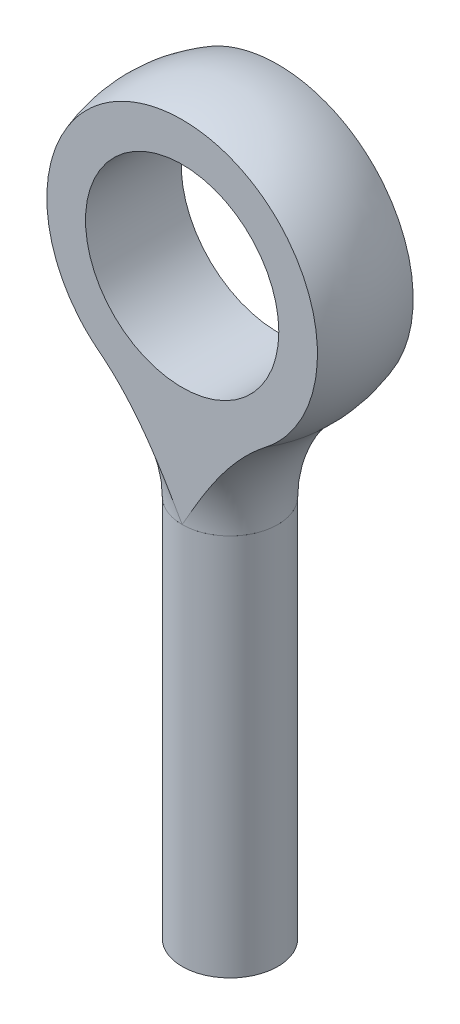
ISO-10303-21;
HEADER;
FILE_DESCRIPTION(('STEP AP214'),'2;1');
FILE_NAME('part.step','',(''),(''),'','','');
FILE_SCHEMA(('AUTOMOTIVE_DESIGN { 1 0 10303 214 1 1 1 1 }'));
ENDSEC;
DATA;
#1=APPLICATION_CONTEXT('core data for automotive mechanical design processes');
#2=APPLICATION_PROTOCOL_DEFINITION('international standard','automotive_design',2000,#1);
#3=PRODUCT_CONTEXT('',#1,'mechanical');
#4=PRODUCT('Part','Part','',(#3));
#5=PRODUCT_RELATED_PRODUCT_CATEGORY('part','',(#4));
#6=PRODUCT_DEFINITION_FORMATION('','',#4);
#7=PRODUCT_DEFINITION_CONTEXT('part definition',#1,'design');
#8=PRODUCT_DEFINITION('design','',#6,#7);
#9=PRODUCT_DEFINITION_SHAPE('','',#8);
#10=(LENGTH_UNIT() NAMED_UNIT(*) SI_UNIT(.MILLI.,.METRE.));
#11=(NAMED_UNIT(*) PLANE_ANGLE_UNIT() SI_UNIT($,.RADIAN.));
#12=(NAMED_UNIT(*) SI_UNIT($,.STERADIAN.) SOLID_ANGLE_UNIT());
#13=UNCERTAINTY_MEASURE_WITH_UNIT(LENGTH_MEASURE(1.E-05),#10,'distance_accuracy_value','');
#14=(GEOMETRIC_REPRESENTATION_CONTEXT(3) GLOBAL_UNCERTAINTY_ASSIGNED_CONTEXT((#13)) GLOBAL_UNIT_ASSIGNED_CONTEXT((#10,
#11,#12)) REPRESENTATION_CONTEXT('',''));
#15=CARTESIAN_POINT('',(0.,0.,0.));
#16=DIRECTION('',(0.,0.,1.));
#17=DIRECTION('',(1.,0.,0.));
#18=AXIS2_PLACEMENT_3D('',#15,#16,#17);
#19=CARTESIAN_POINT('',(0.,0.,0.));
#20=DIRECTION('',(0.,1.,0.));
#21=DIRECTION('',(-1.,0.,0.));
#22=AXIS2_PLACEMENT_3D('',#19,#20,#21);
#23=TOROIDAL_SURFACE('',#22,12.8984375,9.72343749999999);
#24=CARTESIAN_POINT('',(0.,0.,0.));
#25=DIRECTION('',(0.,1.,0.));
#26=DIRECTION('',(-1.,0.,0.));
#27=AXIS2_PLACEMENT_3D('',#24,#25,#26);
#28=CIRCLE('',#27,3.17499999999999);
#29=CARTESIAN_POINT('',(0.,0.,3.17499999999999));
#30=VERTEX_POINT('',#29);
#31=CARTESIAN_POINT('',(0.,0.,-3.17499999999999));
#32=VERTEX_POINT('',#31);
#33=EDGE_CURVE('E95',#30,#32,#28,.T.);
#34=ORIENTED_EDGE('',*,*,#33,.T.);
#35=CARTESIAN_POINT('',(0.,0.,-3.17500000000001));
#36=CARTESIAN_POINT('',(0.00326153280925607,0.0057076845832613,-3.17500000000001));
#37=CARTESIAN_POINT('',(0.00652306727233209,0.0114153698480768,-3.17500000000002));
#38=CARTESIAN_POINT('',(0.273129494103205,0.477974240386817,-3.1750000000004));
#39=CARTESIAN_POINT('',(0.536560192564701,0.938786382511424,-3.17500000000012));
#40=CARTESIAN_POINT('',(1.07566265444869,1.85322785392022,-3.17499999999992));
#41=CARTESIAN_POINT('',(1.35133223121141,2.3068584468054,-3.17499999999999));
#42=CARTESIAN_POINT('',(1.92559609432879,3.19894900715336,-3.17500000000004));
#43=CARTESIAN_POINT('',(2.22416629490134,3.63742422867332,-3.17500000000002));
#44=CARTESIAN_POINT('',(2.85309895626272,4.49102276263993,-3.17500000000001));
#45=CARTESIAN_POINT('',(3.18344395159612,4.9061587072404,-3.17500000000001));
#46=CARTESIAN_POINT('',(3.77466960905666,5.58162755339801,-3.17500000000001));
#47=CARTESIAN_POINT('',(4.0258500915174,5.85044049904177,-3.17500000000001));
#48=CARTESIAN_POINT('',(4.54711374407405,6.3690146541668,-3.17500000000001));
#49=CARTESIAN_POINT('',(4.81719088353272,6.61878188915435,-3.17500000000001));
#50=CARTESIAN_POINT('',(5.37662445731924,7.09612768080226,-3.17500000000001));
#51=CARTESIAN_POINT('',(5.66599147541127,7.32369388493563,-3.17500000000001));
#52=CARTESIAN_POINT('',(6.26322715755371,7.75319037760378,-3.17500000000001));
#53=CARTESIAN_POINT('',(6.57109562034731,7.95512094492604,-3.17500000000001));
#54=CARTESIAN_POINT('',(7.20718830531294,8.33213779574423,-3.17500000000001));
#55=CARTESIAN_POINT('',(7.53558873717857,8.50692791162476,-3.17500000000001));
#56=CARTESIAN_POINT('',(8.20771747668496,8.82419193058537,-3.17500000000001));
#57=CARTESIAN_POINT('',(8.55144656908544,8.96666417685532,-3.17500000000001));
#58=CARTESIAN_POINT('',(9.25110720222469,9.21656726401151,-3.17500000000001));
#59=CARTESIAN_POINT('',(9.60702765350869,9.32402906217074,-3.17500000000001));
#60=CARTESIAN_POINT('',(10.3280020281628,9.50191139488332,-3.17500000000001));
#61=CARTESIAN_POINT('',(10.6930544047708,9.57233815850714,-3.17500000000001));
#62=CARTESIAN_POINT('',(11.374148117763,9.66696888095685,-3.17500000000001));
#63=CARTESIAN_POINT('',(11.6894621095443,9.69646466998725,-3.17500000000001));
#64=CARTESIAN_POINT('',(12.3214131945616,9.72667494727204,-3.17500000000001));
#65=CARTESIAN_POINT('',(12.6380499892568,9.72739561225399,-3.17500000000001));
#66=CARTESIAN_POINT('',(13.2714560117321,9.69958458823531,-3.17500000000001));
#67=CARTESIAN_POINT('',(13.5882199938706,9.67092754785116,-3.17500000000001));
#68=CARTESIAN_POINT('',(14.0603016308951,9.60580647493132,-3.17500000000001));
#69=CARTESIAN_POINT('',(14.2172131664777,9.58039570302873,-3.17500000000001));
#70=CARTESIAN_POINT('',(14.5296709917818,9.52221005311375,-3.17500000000001));
#71=CARTESIAN_POINT('',(14.6852172274489,9.48943488488835,-3.17500000000001));
#72=CARTESIAN_POINT('',(14.8399244089043,9.45298870973377,-3.17500000000001));
#73=B_SPLINE_CURVE_WITH_KNOTS('',3,(#35,#36,#37,#38,#39,#40,#41,#42,#43,#44,#45,#46,#47,#48,#49,
#50,#51,#52,#53,#54,#55,#56,#57,#58,#59,#60,#61,#62,#63,#64,#65,#66,#67,#68,#69,#70,#71,#72),
.UNSPECIFIED.,.F.,.F.,(4,2,2,2,2,2,2,2,2,2,2,2,2,2,2,2,2,2,4),(0.,0.0197214984217776,
1.61208077496624,3.20415668854148,4.79458050737365,6.38413506978644,7.48699761771061,
8.58950979193574,9.69263194037353,10.7957420913339,11.91015194267,13.0246189125133,
14.1380977461375,15.2513892393585,16.2001992986528,17.1488056899198,18.1014765941837,
18.5781908797589,19.0549239547851),.UNSPECIFIED.);
#74=CARTESIAN_POINT('',(5.53702467554139,7.21739690722649,-3.17500000000001));
#75=VERTEX_POINT('',#74);
#76=EDGE_CURVE('E12',#32,#75,#73,.T.);
#77=ORIENTED_EDGE('',*,*,#76,.T.);
#78=CARTESIAN_POINT('',(0.,7.2173969072165,0.));
#79=DIRECTION('',(0.,1.,0.));
#80=DIRECTION('',(-1.,0.,0.));
#81=AXIS2_PLACEMENT_3D('',#78,#79,#80);
#82=CIRCLE('',#81,6.38273195876288);
#83=CARTESIAN_POINT('',(5.5370246755414,7.21739690722649,3.17500000000001));
#84=VERTEX_POINT('',#83);
#85=EDGE_CURVE('E101',#84,#75,#82,.T.);
#86=ORIENTED_EDGE('',*,*,#85,.F.);
#87=CARTESIAN_POINT('',(0.,0.,3.175));
#88=CARTESIAN_POINT('',(0.00326153280983366,0.00570768458293391,3.17500000000001));
#89=CARTESIAN_POINT('',(0.00652306727347502,0.0114153698474264,3.17500000000001));
#90=CARTESIAN_POINT('',(0.273129494151941,0.477974240364465,3.1750000000003));
#91=CARTESIAN_POINT('',(0.536560192581877,0.938786382512609,3.17500000000009));
#92=CARTESIAN_POINT('',(1.07566265444589,1.85322785394333,3.17499999999994));
#93=CARTESIAN_POINT('',(1.35133223122016,2.30685844682691,3.17499999999999));
#94=CARTESIAN_POINT('',(1.92559609434861,3.19894900717623,3.17500000000003));
#95=CARTESIAN_POINT('',(2.2241662949206,3.6374242286992,3.17500000000002));
#96=CARTESIAN_POINT('',(2.85309895628501,4.49102276267044,3.175));
#97=CARTESIAN_POINT('',(3.18344395162206,4.90615870727247,3.17500000000001));
#98=CARTESIAN_POINT('',(3.77466960908563,5.58162755342941,3.17500000000001));
#99=CARTESIAN_POINT('',(4.02585009154564,5.85044049907114,3.17500000000001));
#100=CARTESIAN_POINT('',(4.54711374410087,6.3690146541922,3.17500000000001));
#101=CARTESIAN_POINT('',(4.81719088355883,6.61878188917779,3.17500000000001));
#102=CARTESIAN_POINT('',(5.37662445734494,7.09612768082301,3.17500000000001));
#103=CARTESIAN_POINT('',(5.66599147543737,7.32369388495554,3.17500000000001));
#104=CARTESIAN_POINT('',(6.26322715758068,7.75319037762204,3.17500000000001));
#105=CARTESIAN_POINT('',(6.57109562037478,7.95512094494346,3.17500000000001));
#106=CARTESIAN_POINT('',(7.20718830534095,8.33213779575968,3.17500000000001));
#107=CARTESIAN_POINT('',(7.53558873720661,8.50692791163909,3.17500000000001));
#108=CARTESIAN_POINT('',(8.20771747671292,8.82419193059747,3.17500000000001));
#109=CARTESIAN_POINT('',(8.55144656911327,8.9666641768663,3.17500000000001));
#110=CARTESIAN_POINT('',(9.25110720225114,9.21656726401992,3.17500000000001));
#111=CARTESIAN_POINT('',(9.60702765353383,9.3240290621778,3.17500000000001));
#112=CARTESIAN_POINT('',(10.3280020281852,9.50191139488799,3.17500000000001));
#113=CARTESIAN_POINT('',(10.6930544047918,9.57233815851074,3.17500000000001));
#114=CARTESIAN_POINT('',(11.3741481177817,9.66696888095886,3.17500000000001));
#115=CARTESIAN_POINT('',(11.6894621095622,9.69646466998862,3.17500000000001));
#116=CARTESIAN_POINT('',(12.3214131945779,9.7266749472723,3.17500000000001));
#117=CARTESIAN_POINT('',(12.6380499892723,9.72739561225377,3.17500000000001));
#118=CARTESIAN_POINT('',(13.271456011747,9.6995845882342,3.17500000000001));
#119=CARTESIAN_POINT('',(13.5882199938857,9.67092754784957,3.17500000000001));
#120=CARTESIAN_POINT('',(14.0603016309106,9.60580647492894,3.17500000000001));
#121=CARTESIAN_POINT('',(14.2172131664933,9.58039570302608,3.17500000000001));
#122=CARTESIAN_POINT('',(14.5296709917976,9.52221005311055,3.17500000000001));
#123=CARTESIAN_POINT('',(14.6852172274648,9.48943488488487,3.17500000000001));
#124=CARTESIAN_POINT('',(14.8399244089203,9.45298870973,3.17500000000001));
#125=B_SPLINE_CURVE_WITH_KNOTS('',3,(#87,#88,#89,#90,#91,#92,#93,#94,#95,#96,#97,#98,#99,#100,
#101,#102,#103,#104,#105,#106,#107,#108,#109,#110,#111,#112,#113,#114,#115,#116,#117,#118,#119,
#120,#121,#122,#123,#124),.UNSPECIFIED.,.F.,.F.,(4,2,2,2,2,2,2,2,2,2,2,2,2,2,2,2,2,2,4),(0.,
0.0197214984217776,1.61208077498055,3.20415668856883,4.79458050740816,6.38413506983101,
7.48699761774936,8.58950979196893,9.69263194040611,10.7957420913663,11.910151942701,
13.0246189125426,14.1380977461619,15.2513892393781,16.2001992986699,17.1488056899344,
18.1014765941992,18.5781908797748,19.0549239548015),.UNSPECIFIED.);
#126=EDGE_CURVE('E87',#84,#30,#125,.F.);
#127=ORIENTED_EDGE('',*,*,#126,.T.);
#128=EDGE_LOOP('',(#34,#77,#86,#127));
#129=FACE_BOUND('',#128,.T.);
#130=ADVANCED_FACE('F51',(#129),#23,.F.);
#131=CARTESIAN_POINT('',(0.,14.2875,0.));
#132=DIRECTION('',(0.,1.,0.));
#133=DIRECTION('',(1.,0.,0.));
#134=AXIS2_PLACEMENT_3D('',#131,#132,#133);
#135=SPHERICAL_SURFACE('',#134,9.525);
#136=ORIENTED_EDGE('',*,*,#85,.T.);
#137=CARTESIAN_POINT('',(0.,14.2875,-3.175));
#138=DIRECTION('',(0.,0.,1.));
#139=DIRECTION('',(0.,-1.,0.));
#140=AXIS2_PLACEMENT_3D('',#137,#138,#139);
#141=CIRCLE('',#140,8.98025612106915);
#142=CARTESIAN_POINT('',(-5.5370246755414,7.21739690722649,-3.17500000000001));
#143=VERTEX_POINT('',#142);
#144=EDGE_CURVE('E104',#75,#143,#141,.T.);
#145=ORIENTED_EDGE('',*,*,#144,.T.);
#146=CARTESIAN_POINT('',(-5.53702467554139,7.21739690722648,3.17500000000001));
#147=VERTEX_POINT('',#146);
#148=EDGE_CURVE('E103',#143,#147,#82,.T.);
#149=ORIENTED_EDGE('',*,*,#148,.T.);
#150=CARTESIAN_POINT('',(0.,14.2875,3.175));
#151=DIRECTION('',(0.,0.,-1.));
#152=DIRECTION('',(0.,1.,0.));
#153=AXIS2_PLACEMENT_3D('',#150,#151,#152);
#154=CIRCLE('',#153,8.98025612106915);
#155=EDGE_CURVE('E90',#147,#84,#154,.T.);
#156=ORIENTED_EDGE('',*,*,#155,.T.);
#157=EDGE_LOOP('',(#136,#145,#149,#156));
#158=FACE_BOUND('',#157,.T.);
#159=ADVANCED_FACE('F53',(#158),#135,.T.);
#160=CARTESIAN_POINT('',(3.17499999999999,0.,0.));
#161=DIRECTION('',(0.,1.,0.));
#162=DIRECTION('',(-1.,0.,0.));
#163=AXIS2_PLACEMENT_3D('',#160,#161,#162);
#164=PLANE('',#163);
#165=ORIENTED_EDGE('',*,*,#33,.F.);
#166=EDGE_CURVE('E107',#32,#30,#28,.T.);
#167=ORIENTED_EDGE('',*,*,#166,.F.);
#168=EDGE_LOOP('',(#165,#167));
#169=FACE_BOUND('',#168,.T.);
#170=ADVANCED_FACE('F125',(#169),#164,.F.);
#171=ORIENTED_EDGE('',*,*,#148,.F.);
#172=CARTESIAN_POINT('',(0.,0.,-3.17500000000001));
#173=CARTESIAN_POINT('',(-0.00326153280925607,0.0057076845832613,-3.17500000000001));
#174=CARTESIAN_POINT('',(-0.00652306727233209,0.0114153698480768,-3.17500000000002));
#175=CARTESIAN_POINT('',(-0.273129494103204,0.477974240386817,-3.1750000000004));
#176=CARTESIAN_POINT('',(-0.536560192564701,0.938786382511425,-3.17500000000012));
#177=CARTESIAN_POINT('',(-1.07566265444869,1.85322785392022,-3.17499999999992));
#178=CARTESIAN_POINT('',(-1.35133223121141,2.3068584468054,-3.17499999999999));
#179=CARTESIAN_POINT('',(-1.92559609432879,3.19894900715336,-3.17500000000004));
#180=CARTESIAN_POINT('',(-2.22416629490134,3.63742422867331,-3.17500000000002));
#181=CARTESIAN_POINT('',(-2.85309895626272,4.49102276263993,-3.17500000000001));
#182=CARTESIAN_POINT('',(-3.18344395159612,4.9061587072404,-3.17500000000001));
#183=CARTESIAN_POINT('',(-3.77466960905666,5.58162755339801,-3.17500000000001));
#184=CARTESIAN_POINT('',(-4.0258500915174,5.85044049904176,-3.17500000000001));
#185=CARTESIAN_POINT('',(-4.54711374407406,6.3690146541668,-3.17500000000001));
#186=CARTESIAN_POINT('',(-4.81719088353272,6.61878188915435,-3.17500000000001));
#187=CARTESIAN_POINT('',(-5.37662445731924,7.09612768080226,-3.17500000000001));
#188=CARTESIAN_POINT('',(-5.66599147541127,7.32369388493562,-3.17500000000001));
#189=CARTESIAN_POINT('',(-6.26322715755371,7.75319037760378,-3.17500000000001));
#190=CARTESIAN_POINT('',(-6.57109562034732,7.95512094492604,-3.17500000000001));
#191=CARTESIAN_POINT('',(-7.20718830531295,8.33213779574423,-3.17500000000001));
#192=CARTESIAN_POINT('',(-7.53558873717857,8.50692791162476,-3.17500000000001));
#193=CARTESIAN_POINT('',(-8.20771747668496,8.82419193058537,-3.17500000000001));
#194=CARTESIAN_POINT('',(-8.55144656908544,8.96666417685532,-3.17500000000001));
#195=CARTESIAN_POINT('',(-9.2511072022247,9.2165672640115,-3.17500000000001));
#196=CARTESIAN_POINT('',(-9.60702765350869,9.32402906217073,-3.17500000000001));
#197=CARTESIAN_POINT('',(-10.3280020281628,9.50191139488332,-3.17500000000001));
#198=CARTESIAN_POINT('',(-10.6930544047708,9.57233815850713,-3.17500000000001));
#199=CARTESIAN_POINT('',(-11.374148117763,9.66696888095685,-3.17500000000001));
#200=CARTESIAN_POINT('',(-11.6894621095443,9.69646466998724,-3.17500000000001));
#201=CARTESIAN_POINT('',(-12.3214131945616,9.72667494727204,-3.17500000000001));
#202=CARTESIAN_POINT('',(-12.6380499892568,9.72739561225399,-3.17500000000001));
#203=CARTESIAN_POINT('',(-13.2714560117321,9.6995845882353,-3.17500000000001));
#204=CARTESIAN_POINT('',(-13.5882199938706,9.67092754785116,-3.17500000000001));
#205=CARTESIAN_POINT('',(-14.0603016308951,9.60580647493132,-3.17500000000001));
#206=CARTESIAN_POINT('',(-14.2172131664777,9.58039570302873,-3.17500000000001));
#207=CARTESIAN_POINT('',(-14.5296709917818,9.52221005311375,-3.17500000000001));
#208=CARTESIAN_POINT('',(-14.6852172274489,9.48943488488835,-3.17500000000001));
#209=CARTESIAN_POINT('',(-14.8399244089043,9.45298870973377,-3.17500000000001));
#210=B_SPLINE_CURVE_WITH_KNOTS('',3,(#172,#173,#174,#175,#176,#177,#178,#179,#180,#181,#182,
#183,#184,#185,#186,#187,#188,#189,#190,#191,#192,#193,#194,#195,#196,#197,#198,#199,#200,#201,
#202,#203,#204,#205,#206,#207,#208,#209),.UNSPECIFIED.,.F.,.F.,(4,2,2,2,2,2,2,2,2,2,2,2,2,2,2,2,
2,2,4),(0.,0.0197214984217776,1.61208077496624,3.20415668854148,4.79458050737365,
6.38413506978644,7.48699761771061,8.58950979193574,9.69263194037353,10.7957420913339,
11.91015194267,13.0246189125133,14.1380977461375,15.2513892393585,16.2001992986528,
17.1488056899198,18.1014765941837,18.5781908797589,19.0549239547851),.UNSPECIFIED.);
#211=EDGE_CURVE('E65',#143,#32,#210,.F.);
#212=ORIENTED_EDGE('',*,*,#211,.T.);
#213=ORIENTED_EDGE('',*,*,#166,.T.);
#214=CARTESIAN_POINT('',(0.,0.,3.175));
#215=CARTESIAN_POINT('',(-0.00326153280983366,0.00570768458293391,3.17500000000001));
#216=CARTESIAN_POINT('',(-0.00652306727347502,0.0114153698474264,3.17500000000001));
#217=CARTESIAN_POINT('',(-0.273129494151941,0.477974240364465,3.1750000000003));
#218=CARTESIAN_POINT('',(-0.536560192581877,0.938786382512609,3.17500000000009));
#219=CARTESIAN_POINT('',(-1.07566265444589,1.85322785394333,3.17499999999994));
#220=CARTESIAN_POINT('',(-1.35133223122016,2.30685844682691,3.17499999999999));
#221=CARTESIAN_POINT('',(-1.92559609434862,3.19894900717623,3.17500000000003));
#222=CARTESIAN_POINT('',(-2.22416629492061,3.6374242286992,3.17500000000002));
#223=CARTESIAN_POINT('',(-2.85309895628501,4.49102276267044,3.175));
#224=CARTESIAN_POINT('',(-3.18344395162206,4.90615870727247,3.17500000000001));
#225=CARTESIAN_POINT('',(-3.77466960908563,5.58162755342941,3.17500000000001));
#226=CARTESIAN_POINT('',(-4.02585009154565,5.85044049907114,3.17500000000001));
#227=CARTESIAN_POINT('',(-4.54711374410087,6.3690146541922,3.17500000000001));
#228=CARTESIAN_POINT('',(-4.81719088355883,6.61878188917779,3.17500000000001));
#229=CARTESIAN_POINT('',(-5.37662445734494,7.09612768082301,3.17500000000001));
#230=CARTESIAN_POINT('',(-5.66599147543737,7.32369388495554,3.17500000000001));
#231=CARTESIAN_POINT('',(-6.26322715758069,7.75319037762204,3.17500000000001));
#232=CARTESIAN_POINT('',(-6.57109562037478,7.95512094494346,3.17500000000001));
#233=CARTESIAN_POINT('',(-7.20718830534096,8.33213779575967,3.17500000000001));
#234=CARTESIAN_POINT('',(-7.53558873720662,8.50692791163909,3.17500000000001));
#235=CARTESIAN_POINT('',(-8.20771747671292,8.82419193059747,3.17500000000001));
#236=CARTESIAN_POINT('',(-8.55144656911327,8.9666641768663,3.17500000000001));
#237=CARTESIAN_POINT('',(-9.25110720225114,9.21656726401991,3.17500000000001));
#238=CARTESIAN_POINT('',(-9.60702765353383,9.3240290621778,3.17500000000001));
#239=CARTESIAN_POINT('',(-10.3280020281852,9.50191139488799,3.17500000000001));
#240=CARTESIAN_POINT('',(-10.6930544047918,9.57233815851074,3.17500000000001));
#241=CARTESIAN_POINT('',(-11.3741481177817,9.66696888095885,3.17500000000001));
#242=CARTESIAN_POINT('',(-11.6894621095622,9.69646466998862,3.17500000000001));
#243=CARTESIAN_POINT('',(-12.3214131945779,9.7266749472723,3.17500000000001));
#244=CARTESIAN_POINT('',(-12.6380499892723,9.72739561225376,3.17500000000001));
#245=CARTESIAN_POINT('',(-13.271456011747,9.6995845882342,3.17500000000001));
#246=CARTESIAN_POINT('',(-13.5882199938857,9.67092754784956,3.17500000000001));
#247=CARTESIAN_POINT('',(-14.0603016309106,9.60580647492894,3.17500000000001));
#248=CARTESIAN_POINT('',(-14.2172131664933,9.58039570302608,3.17500000000001));
#249=CARTESIAN_POINT('',(-14.5296709917976,9.52221005311055,3.17500000000001));
#250=CARTESIAN_POINT('',(-14.6852172274648,9.48943488488487,3.17500000000001));
#251=CARTESIAN_POINT('',(-14.8399244089203,9.45298870973,3.17500000000001));
#252=B_SPLINE_CURVE_WITH_KNOTS('',3,(#214,#215,#216,#217,#218,#219,#220,#221,#222,#223,#224,
#225,#226,#227,#228,#229,#230,#231,#232,#233,#234,#235,#236,#237,#238,#239,#240,#241,#242,#243,
#244,#245,#246,#247,#248,#249,#250,#251),.UNSPECIFIED.,.F.,.F.,(4,2,2,2,2,2,2,2,2,2,2,2,2,2,2,2,
2,2,4),(0.,0.0197214984217776,1.61208077498055,3.20415668856883,4.79458050740816,
6.38413506983102,7.48699761774936,8.58950979196893,9.69263194040611,10.7957420913663,
11.910151942701,13.0246189125426,14.1380977461619,15.2513892393781,16.2001992986699,
17.1488056899344,18.1014765941992,18.5781908797748,19.0549239548015),.UNSPECIFIED.);
#253=EDGE_CURVE('E78',#30,#147,#252,.T.);
#254=ORIENTED_EDGE('',*,*,#253,.T.);
#255=EDGE_LOOP('',(#171,#212,#213,#254));
#256=FACE_BOUND('',#255,.T.);
#257=ADVANCED_FACE('F122',(#256),#23,.F.);
#258=CARTESIAN_POINT('',(-9.52499999999999,14.2875,3.175));
#259=DIRECTION('',(0.,0.,-1.));
#260=DIRECTION('',(0.,1.,0.));
#261=AXIS2_PLACEMENT_3D('',#258,#259,#260);
#262=PLANE('',#261);
#263=CARTESIAN_POINT('',(0.,14.2875,3.175));
#264=DIRECTION('',(0.,0.,1.));
#265=DIRECTION('',(1.,0.,0.));
#266=AXIS2_PLACEMENT_3D('',#263,#264,#265);
#267=CIRCLE('',#266,6.4135);
#268=CARTESIAN_POINT('',(6.4135,14.2875,3.175));
#269=VERTEX_POINT('',#268);
#270=EDGE_CURVE('E209',#269,#269,#267,.T.);
#271=ORIENTED_EDGE('',*,*,#270,.F.);
#272=EDGE_LOOP('',(#271));
#273=FACE_BOUND('',#272,.T.);
#274=ORIENTED_EDGE('',*,*,#253,.F.);
#275=ORIENTED_EDGE('',*,*,#126,.F.);
#276=ORIENTED_EDGE('',*,*,#155,.F.);
#277=EDGE_LOOP('',(#274,#275,#276));
#278=FACE_BOUND('',#277,.T.);
#279=ADVANCED_FACE('F89',(#273,#278),#262,.F.);
#280=CARTESIAN_POINT('',(-9.52499999999999,14.2875,-3.175));
#281=DIRECTION('',(0.,0.,1.));
#282=DIRECTION('',(0.,-1.,0.));
#283=AXIS2_PLACEMENT_3D('',#280,#281,#282);
#284=PLANE('',#283);
#285=CARTESIAN_POINT('',(0.,14.2875,-3.175));
#286=DIRECTION('',(0.,0.,1.));
#287=DIRECTION('',(1.,0.,0.));
#288=AXIS2_PLACEMENT_3D('',#285,#286,#287);
#289=CIRCLE('',#288,6.4135);
#290=CARTESIAN_POINT('',(6.4135,14.2875,-3.175));
#291=VERTEX_POINT('',#290);
#292=EDGE_CURVE('E105',#291,#291,#289,.T.);
#293=ORIENTED_EDGE('',*,*,#292,.T.);
#294=EDGE_LOOP('',(#293));
#295=FACE_BOUND('',#294,.T.);
#296=ORIENTED_EDGE('',*,*,#76,.F.);
#297=ORIENTED_EDGE('',*,*,#211,.F.);
#298=ORIENTED_EDGE('',*,*,#144,.F.);
#299=EDGE_LOOP('',(#296,#297,#298));
#300=FACE_BOUND('',#299,.T.);
#301=ADVANCED_FACE('F134',(#295,#300),#284,.F.);
#302=CARTESIAN_POINT('',(0.,14.2875,-3.175));
#303=DIRECTION('',(0.,0.,1.));
#304=DIRECTION('',(1.,0.,0.));
#305=AXIS2_PLACEMENT_3D('',#302,#303,#304);
#306=CYLINDRICAL_SURFACE('',#305,6.4135);
#307=ORIENTED_EDGE('',*,*,#292,.F.);
#308=EDGE_LOOP('',(#307));
#309=FACE_BOUND('',#308,.T.);
#310=ORIENTED_EDGE('',*,*,#270,.T.);
#311=EDGE_LOOP('',(#310));
#312=FACE_BOUND('',#311,.T.);
#313=ADVANCED_FACE('F138',(#309,#312),#306,.F.);
#314=CLOSED_SHELL('',(#130,#159,#170,#257,#279,#301,#313));
#315=MANIFOLD_SOLID_BREP('B2',#314);
#316=CARTESIAN_POINT('',(3.175,0.,0.));
#317=DIRECTION('',(0.,-1.,0.));
#318=DIRECTION('',(1.,0.,0.));
#319=AXIS2_PLACEMENT_3D('',#316,#317,#318);
#320=PLANE('',#319);
#321=CARTESIAN_POINT('',(0.,0.,0.));
#322=DIRECTION('',(0.,1.,0.));
#323=DIRECTION('',(-1.,0.,0.));
#324=AXIS2_PLACEMENT_3D('',#321,#322,#323);
#325=CIRCLE('',#324,3.175);
#326=CARTESIAN_POINT('',(-3.175,0.,0.));
#327=VERTEX_POINT('',#326);
#328=EDGE_CURVE('E223',#327,#327,#325,.T.);
#329=ORIENTED_EDGE('',*,*,#328,.T.);
#330=EDGE_LOOP('',(#329));
#331=FACE_BOUND('',#330,.T.);
#332=ADVANCED_FACE('F217',(#331),#320,.F.);
#333=CARTESIAN_POINT('',(0.,-25.4,0.));
#334=DIRECTION('',(0.,1.,0.));
#335=DIRECTION('',(-1.,0.,0.));
#336=AXIS2_PLACEMENT_3D('',#333,#334,#335);
#337=PLANE('',#336);
#338=CARTESIAN_POINT('',(0.,-25.4,0.));
#339=DIRECTION('',(0.,1.,0.));
#340=DIRECTION('',(-1.,0.,0.));
#341=AXIS2_PLACEMENT_3D('',#338,#339,#340);
#342=CIRCLE('',#341,3.175);
#343=CARTESIAN_POINT('',(-3.17499999999999,-25.4,0.));
#344=VERTEX_POINT('',#343);
#345=EDGE_CURVE('E50',#344,#344,#342,.T.);
#346=ORIENTED_EDGE('',*,*,#345,.F.);
#347=EDGE_LOOP('',(#346));
#348=FACE_BOUND('',#347,.T.);
#349=ADVANCED_FACE('F232',(#348),#337,.F.);
#350=CARTESIAN_POINT('',(0.,0.,0.));
#351=DIRECTION('',(0.,1.,0.));
#352=DIRECTION('',(-1.,0.,0.));
#353=AXIS2_PLACEMENT_3D('',#350,#351,#352);
#354=CYLINDRICAL_SURFACE('',#353,3.175);
#355=ORIENTED_EDGE('',*,*,#328,.F.);
#356=EDGE_LOOP('',(#355));
#357=FACE_BOUND('',#356,.T.);
#358=ORIENTED_EDGE('',*,*,#345,.T.);
#359=EDGE_LOOP('',(#358));
#360=FACE_BOUND('',#359,.T.);
#361=ADVANCED_FACE('F230',(#357,#360),#354,.T.);
#362=CLOSED_SHELL('',(#332,#349,#361));
#363=MANIFOLD_SOLID_BREP('B6',#362);
#364=ADVANCED_BREP_SHAPE_REPRESENTATION('',(#18,#315,#363),#14);
#365=SHAPE_DEFINITION_REPRESENTATION(#9,#364);
ENDSEC;
END-ISO-10303-21;
